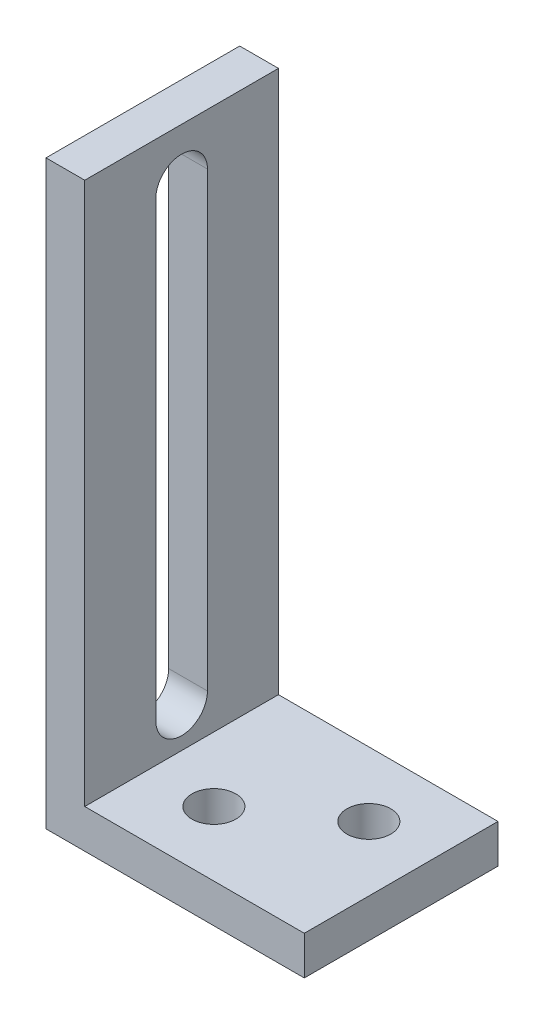
ISO-10303-21;
HEADER;
FILE_DESCRIPTION(('STEP AP214'),'2;1');
FILE_NAME('part.step','',(''),(''),'','','');
FILE_SCHEMA(('AUTOMOTIVE_DESIGN { 1 0 10303 214 1 1 1 1 }'));
ENDSEC;
DATA;
#1=APPLICATION_CONTEXT('core data for automotive mechanical design processes');
#2=APPLICATION_PROTOCOL_DEFINITION('international standard','automotive_design',2000,#1);
#3=PRODUCT_CONTEXT('',#1,'mechanical');
#4=PRODUCT('Part','Part','',(#3));
#5=PRODUCT_RELATED_PRODUCT_CATEGORY('part','',(#4));
#6=PRODUCT_DEFINITION_FORMATION('','',#4);
#7=PRODUCT_DEFINITION_CONTEXT('part definition',#1,'design');
#8=PRODUCT_DEFINITION('design','',#6,#7);
#9=PRODUCT_DEFINITION_SHAPE('','',#8);
#10=(LENGTH_UNIT() NAMED_UNIT(*) SI_UNIT(.MILLI.,.METRE.));
#11=(NAMED_UNIT(*) PLANE_ANGLE_UNIT() SI_UNIT($,.RADIAN.));
#12=(NAMED_UNIT(*) SI_UNIT($,.STERADIAN.) SOLID_ANGLE_UNIT());
#13=UNCERTAINTY_MEASURE_WITH_UNIT(LENGTH_MEASURE(1.E-05),#10,'distance_accuracy_value','');
#14=(GEOMETRIC_REPRESENTATION_CONTEXT(3) GLOBAL_UNCERTAINTY_ASSIGNED_CONTEXT((#13)) GLOBAL_UNIT_ASSIGNED_CONTEXT((#10,
#11,#12)) REPRESENTATION_CONTEXT('',''));
#15=CARTESIAN_POINT('',(0.,0.,0.));
#16=DIRECTION('',(0.,0.,1.));
#17=DIRECTION('',(1.,0.,0.));
#18=AXIS2_PLACEMENT_3D('',#15,#16,#17);
#19=CARTESIAN_POINT('',(0.,0.,15.));
#20=DIRECTION('',(1.,0.,0.));
#21=DIRECTION('',(0.,0.,-1.));
#22=AXIS2_PLACEMENT_3D('',#19,#20,#21);
#23=PLANE('',#22);
#24=DIRECTION('',(0.,-1.,0.));
#25=VECTOR('',#24,1.);
#26=CARTESIAN_POINT('',(0.,0.,5.5));
#27=LINE('',#26,#25);
#28=CARTESIAN_POINT('',(0.,41.,5.5));
#29=VERTEX_POINT('',#28);
#30=CARTESIAN_POINT('',(0.,6.,5.5));
#31=VERTEX_POINT('',#30);
#32=EDGE_CURVE('E141',#29,#31,#27,.T.);
#33=ORIENTED_EDGE('',*,*,#32,.F.);
#34=CARTESIAN_POINT('',(0.,41.,7.5));
#35=DIRECTION('',(-1.,0.,0.));
#36=DIRECTION('',(0.,0.,1.));
#37=AXIS2_PLACEMENT_3D('',#34,#35,#36);
#38=CIRCLE('',#37,2.);
#39=CARTESIAN_POINT('',(0.,41.,9.5));
#40=VERTEX_POINT('',#39);
#41=EDGE_CURVE('E67',#40,#29,#38,.T.);
#42=ORIENTED_EDGE('',*,*,#41,.F.);
#43=DIRECTION('',(0.,1.,0.));
#44=VECTOR('',#43,1.);
#45=CARTESIAN_POINT('',(0.,0.,9.5));
#46=LINE('',#45,#44);
#47=CARTESIAN_POINT('',(0.,6.,9.5));
#48=VERTEX_POINT('',#47);
#49=EDGE_CURVE('E147',#48,#40,#46,.T.);
#50=ORIENTED_EDGE('',*,*,#49,.F.);
#51=CARTESIAN_POINT('',(0.,6.,7.5));
#52=DIRECTION('',(-1.,0.,0.));
#53=DIRECTION('',(0.,0.,1.));
#54=AXIS2_PLACEMENT_3D('',#51,#52,#53);
#55=CIRCLE('',#54,2.);
#56=EDGE_CURVE('E132',#31,#48,#55,.T.);
#57=ORIENTED_EDGE('',*,*,#56,.F.);
#58=EDGE_LOOP('',(#33,#42,#50,#57));
#59=FACE_BOUND('',#58,.T.);
#60=DIRECTION('',(0.,-1.,0.));
#61=VECTOR('',#60,1.);
#62=CARTESIAN_POINT('',(0.,0.,0.));
#63=LINE('',#62,#61);
#64=CARTESIAN_POINT('',(0.,45.,0.));
#65=VERTEX_POINT('',#64);
#66=CARTESIAN_POINT('',(0.,0.,0.));
#67=VERTEX_POINT('',#66);
#68=EDGE_CURVE('E154',#65,#67,#63,.T.);
#69=ORIENTED_EDGE('',*,*,#68,.T.);
#70=DIRECTION('',(0.,0.,-1.));
#71=VECTOR('',#70,1.);
#72=CARTESIAN_POINT('',(0.,0.,15.));
#73=LINE('',#72,#71);
#74=CARTESIAN_POINT('',(0.,0.,15.));
#75=VERTEX_POINT('',#74);
#76=EDGE_CURVE('E197',#75,#67,#73,.T.);
#77=ORIENTED_EDGE('',*,*,#76,.F.);
#78=DIRECTION('',(0.,-1.,0.));
#79=VECTOR('',#78,1.);
#80=CARTESIAN_POINT('',(0.,0.,15.));
#81=LINE('',#80,#79);
#82=CARTESIAN_POINT('',(0.,45.,15.));
#83=VERTEX_POINT('',#82);
#84=EDGE_CURVE('E157',#83,#75,#81,.T.);
#85=ORIENTED_EDGE('',*,*,#84,.F.);
#86=DIRECTION('',(0.,0.,-1.));
#87=VECTOR('',#86,1.);
#88=CARTESIAN_POINT('',(0.,45.,15.));
#89=LINE('',#88,#87);
#90=EDGE_CURVE('E171',#83,#65,#89,.T.);
#91=ORIENTED_EDGE('',*,*,#90,.T.);
#92=EDGE_LOOP('',(#69,#77,#85,#91));
#93=FACE_BOUND('',#92,.T.);
#94=ADVANCED_FACE('F53',(#59,#93),#23,.F.);
#95=CARTESIAN_POINT('',(0.,0.,15.));
#96=DIRECTION('',(0.,1.,0.));
#97=DIRECTION('',(0.,0.,1.));
#98=AXIS2_PLACEMENT_3D('',#95,#96,#97);
#99=PLANE('',#98);
#100=CARTESIAN_POINT('',(15.,0.,5.));
#101=DIRECTION('',(0.,1.,0.));
#102=DIRECTION('',(0.,0.,1.));
#103=AXIS2_PLACEMENT_3D('',#100,#101,#102);
#104=CIRCLE('',#103,1.7);
#105=CARTESIAN_POINT('',(15.,0.,6.69999999999999));
#106=VERTEX_POINT('',#105);
#107=EDGE_CURVE('E352',#106,#106,#104,.F.);
#108=ORIENTED_EDGE('',*,*,#107,.F.);
#109=EDGE_LOOP('',(#108));
#110=FACE_BOUND('',#109,.T.);
#111=CARTESIAN_POINT('',(8.,0.,10.));
#112=DIRECTION('',(0.,1.,0.));
#113=DIRECTION('',(0.,0.,1.));
#114=AXIS2_PLACEMENT_3D('',#111,#112,#113);
#115=CIRCLE('',#114,1.7);
#116=CARTESIAN_POINT('',(8.,0.,11.7));
#117=VERTEX_POINT('',#116);
#118=EDGE_CURVE('E356',#117,#117,#115,.F.);
#119=ORIENTED_EDGE('',*,*,#118,.F.);
#120=EDGE_LOOP('',(#119));
#121=FACE_BOUND('',#120,.T.);
#122=DIRECTION('',(1.,0.,0.));
#123=VECTOR('',#122,1.);
#124=CARTESIAN_POINT('',(0.,0.,0.));
#125=LINE('',#124,#123);
#126=CARTESIAN_POINT('',(20.,0.,0.));
#127=VERTEX_POINT('',#126);
#128=EDGE_CURVE('E174',#67,#127,#125,.T.);
#129=ORIENTED_EDGE('',*,*,#128,.T.);
#130=DIRECTION('',(0.,0.,-1.));
#131=VECTOR('',#130,1.);
#132=CARTESIAN_POINT('',(20.,0.,15.));
#133=LINE('',#132,#131);
#134=CARTESIAN_POINT('',(20.,0.,15.));
#135=VERTEX_POINT('',#134);
#136=EDGE_CURVE('E194',#135,#127,#133,.T.);
#137=ORIENTED_EDGE('',*,*,#136,.F.);
#138=DIRECTION('',(1.,0.,0.));
#139=VECTOR('',#138,1.);
#140=CARTESIAN_POINT('',(0.,0.,15.));
#141=LINE('',#140,#139);
#142=EDGE_CURVE('E160',#75,#135,#141,.T.);
#143=ORIENTED_EDGE('',*,*,#142,.F.);
#144=ORIENTED_EDGE('',*,*,#76,.T.);
#145=EDGE_LOOP('',(#129,#137,#143,#144));
#146=FACE_BOUND('',#145,.T.);
#147=ADVANCED_FACE('F224',(#110,#121,#146),#99,.F.);
#148=CARTESIAN_POINT('',(20.,0.,15.));
#149=DIRECTION('',(-1.,0.,0.));
#150=DIRECTION('',(0.,0.,1.));
#151=AXIS2_PLACEMENT_3D('',#148,#149,#150);
#152=PLANE('',#151);
#153=DIRECTION('',(0.,1.,0.));
#154=VECTOR('',#153,1.);
#155=CARTESIAN_POINT('',(20.,0.,0.));
#156=LINE('',#155,#154);
#157=CARTESIAN_POINT('',(20.,3.,0.));
#158=VERTEX_POINT('',#157);
#159=EDGE_CURVE('E176',#127,#158,#156,.T.);
#160=ORIENTED_EDGE('',*,*,#159,.T.);
#161=DIRECTION('',(0.,0.,-1.));
#162=VECTOR('',#161,1.);
#163=CARTESIAN_POINT('',(20.,3.,15.));
#164=LINE('',#163,#162);
#165=CARTESIAN_POINT('',(20.,3.,15.));
#166=VERTEX_POINT('',#165);
#167=EDGE_CURVE('E191',#166,#158,#164,.T.);
#168=ORIENTED_EDGE('',*,*,#167,.F.);
#169=DIRECTION('',(0.,1.,0.));
#170=VECTOR('',#169,1.);
#171=CARTESIAN_POINT('',(20.,0.,15.));
#172=LINE('',#171,#170);
#173=EDGE_CURVE('E163',#135,#166,#172,.T.);
#174=ORIENTED_EDGE('',*,*,#173,.F.);
#175=ORIENTED_EDGE('',*,*,#136,.T.);
#176=EDGE_LOOP('',(#160,#168,#174,#175));
#177=FACE_BOUND('',#176,.T.);
#178=ADVANCED_FACE('F228',(#177),#152,.F.);
#179=CARTESIAN_POINT('',(3.,3.,15.));
#180=DIRECTION('',(0.,-1.,0.));
#181=DIRECTION('',(0.,0.,-1.));
#182=AXIS2_PLACEMENT_3D('',#179,#180,#181);
#183=PLANE('',#182);
#184=CARTESIAN_POINT('',(15.,3.,5.));
#185=DIRECTION('',(0.,1.,0.));
#186=DIRECTION('',(0.,0.,1.));
#187=AXIS2_PLACEMENT_3D('',#184,#185,#186);
#188=CIRCLE('',#187,1.7);
#189=CARTESIAN_POINT('',(15.,3.,6.69999999999999));
#190=VERTEX_POINT('',#189);
#191=EDGE_CURVE('E350',#190,#190,#188,.T.);
#192=ORIENTED_EDGE('',*,*,#191,.F.);
#193=EDGE_LOOP('',(#192));
#194=FACE_BOUND('',#193,.T.);
#195=CARTESIAN_POINT('',(8.,3.,10.));
#196=DIRECTION('',(0.,1.,0.));
#197=DIRECTION('',(0.,0.,1.));
#198=AXIS2_PLACEMENT_3D('',#195,#196,#197);
#199=CIRCLE('',#198,1.7);
#200=CARTESIAN_POINT('',(8.,3.,11.7));
#201=VERTEX_POINT('',#200);
#202=EDGE_CURVE('E353',#201,#201,#199,.T.);
#203=ORIENTED_EDGE('',*,*,#202,.F.);
#204=EDGE_LOOP('',(#203));
#205=FACE_BOUND('',#204,.T.);
#206=DIRECTION('',(-1.,0.,0.));
#207=VECTOR('',#206,1.);
#208=CARTESIAN_POINT('',(3.,3.,0.));
#209=LINE('',#208,#207);
#210=CARTESIAN_POINT('',(3.,3.,0.));
#211=VERTEX_POINT('',#210);
#212=EDGE_CURVE('E178',#158,#211,#209,.T.);
#213=ORIENTED_EDGE('',*,*,#212,.T.);
#214=DIRECTION('',(0.,0.,-1.));
#215=VECTOR('',#214,1.);
#216=CARTESIAN_POINT('',(3.,3.,15.));
#217=LINE('',#216,#215);
#218=CARTESIAN_POINT('',(3.,3.,15.));
#219=VERTEX_POINT('',#218);
#220=EDGE_CURVE('E188',#219,#211,#217,.T.);
#221=ORIENTED_EDGE('',*,*,#220,.F.);
#222=DIRECTION('',(-1.,0.,0.));
#223=VECTOR('',#222,1.);
#224=CARTESIAN_POINT('',(3.,3.,15.));
#225=LINE('',#224,#223);
#226=EDGE_CURVE('E165',#166,#219,#225,.T.);
#227=ORIENTED_EDGE('',*,*,#226,.F.);
#228=ORIENTED_EDGE('',*,*,#167,.T.);
#229=EDGE_LOOP('',(#213,#221,#227,#228));
#230=FACE_BOUND('',#229,.T.);
#231=ADVANCED_FACE('F233',(#194,#205,#230),#183,.F.);
#232=CARTESIAN_POINT('',(3.,45.,15.));
#233=DIRECTION('',(-1.,0.,0.));
#234=DIRECTION('',(0.,-1.,0.));
#235=AXIS2_PLACEMENT_3D('',#232,#233,#234);
#236=PLANE('',#235);
#237=DIRECTION('',(0.,1.,0.));
#238=VECTOR('',#237,1.);
#239=CARTESIAN_POINT('',(3.,45.,9.5));
#240=LINE('',#239,#238);
#241=CARTESIAN_POINT('',(3.,6.,9.5));
#242=VERTEX_POINT('',#241);
#243=CARTESIAN_POINT('',(3.,41.,9.5));
#244=VERTEX_POINT('',#243);
#245=EDGE_CURVE('E60',#242,#244,#240,.T.);
#246=ORIENTED_EDGE('',*,*,#245,.T.);
#247=CARTESIAN_POINT('',(3.,41.,7.5));
#248=DIRECTION('',(-1.,0.,0.));
#249=DIRECTION('',(0.,-1.,0.));
#250=AXIS2_PLACEMENT_3D('',#247,#248,#249);
#251=CIRCLE('',#250,2.);
#252=CARTESIAN_POINT('',(3.,41.,5.5));
#253=VERTEX_POINT('',#252);
#254=EDGE_CURVE('E12',#244,#253,#251,.T.);
#255=ORIENTED_EDGE('',*,*,#254,.T.);
#256=DIRECTION('',(0.,-1.,0.));
#257=VECTOR('',#256,1.);
#258=CARTESIAN_POINT('',(3.,45.,5.5));
#259=LINE('',#258,#257);
#260=CARTESIAN_POINT('',(3.,6.,5.5));
#261=VERTEX_POINT('',#260);
#262=EDGE_CURVE('E200',#253,#261,#259,.T.);
#263=ORIENTED_EDGE('',*,*,#262,.T.);
#264=CARTESIAN_POINT('',(3.,6.,7.5));
#265=DIRECTION('',(-1.,0.,0.));
#266=DIRECTION('',(0.,-1.,0.));
#267=AXIS2_PLACEMENT_3D('',#264,#265,#266);
#268=CIRCLE('',#267,2.);
#269=EDGE_CURVE('E135',#261,#242,#268,.T.);
#270=ORIENTED_EDGE('',*,*,#269,.T.);
#271=EDGE_LOOP('',(#246,#255,#263,#270));
#272=FACE_BOUND('',#271,.T.);
#273=DIRECTION('',(0.,1.,0.));
#274=VECTOR('',#273,1.);
#275=CARTESIAN_POINT('',(3.,45.,0.));
#276=LINE('',#275,#274);
#277=CARTESIAN_POINT('',(3.,45.,0.));
#278=VERTEX_POINT('',#277);
#279=EDGE_CURVE('E180',#211,#278,#276,.T.);
#280=ORIENTED_EDGE('',*,*,#279,.T.);
#281=DIRECTION('',(0.,0.,-1.));
#282=VECTOR('',#281,1.);
#283=CARTESIAN_POINT('',(3.,45.,15.));
#284=LINE('',#283,#282);
#285=CARTESIAN_POINT('',(3.,45.,15.));
#286=VERTEX_POINT('',#285);
#287=EDGE_CURVE('E185',#286,#278,#284,.T.);
#288=ORIENTED_EDGE('',*,*,#287,.F.);
#289=DIRECTION('',(0.,1.,0.));
#290=VECTOR('',#289,1.);
#291=CARTESIAN_POINT('',(3.,45.,15.));
#292=LINE('',#291,#290);
#293=EDGE_CURVE('E167',#219,#286,#292,.T.);
#294=ORIENTED_EDGE('',*,*,#293,.F.);
#295=ORIENTED_EDGE('',*,*,#220,.T.);
#296=EDGE_LOOP('',(#280,#288,#294,#295));
#297=FACE_BOUND('',#296,.T.);
#298=ADVANCED_FACE('F204',(#272,#297),#236,.F.);
#299=CARTESIAN_POINT('',(0.,45.,15.));
#300=DIRECTION('',(0.,-1.,0.));
#301=DIRECTION('',(0.,0.,-1.));
#302=AXIS2_PLACEMENT_3D('',#299,#300,#301);
#303=PLANE('',#302);
#304=DIRECTION('',(-1.,0.,0.));
#305=VECTOR('',#304,1.);
#306=CARTESIAN_POINT('',(0.,45.,0.));
#307=LINE('',#306,#305);
#308=EDGE_CURVE('E161',#278,#65,#307,.T.);
#309=ORIENTED_EDGE('',*,*,#308,.T.);
#310=ORIENTED_EDGE('',*,*,#90,.F.);
#311=DIRECTION('',(-1.,0.,0.));
#312=VECTOR('',#311,1.);
#313=CARTESIAN_POINT('',(0.,45.,15.));
#314=LINE('',#313,#312);
#315=EDGE_CURVE('E169',#286,#83,#314,.T.);
#316=ORIENTED_EDGE('',*,*,#315,.F.);
#317=ORIENTED_EDGE('',*,*,#287,.T.);
#318=EDGE_LOOP('',(#309,#310,#316,#317));
#319=FACE_BOUND('',#318,.T.);
#320=ADVANCED_FACE('F244',(#319),#303,.F.);
#321=CARTESIAN_POINT('',(0.,0.,15.));
#322=DIRECTION('',(0.,0.,-1.));
#323=DIRECTION('',(-1.,0.,0.));
#324=AXIS2_PLACEMENT_3D('',#321,#322,#323);
#325=PLANE('',#324);
#326=ORIENTED_EDGE('',*,*,#84,.T.);
#327=ORIENTED_EDGE('',*,*,#142,.T.);
#328=ORIENTED_EDGE('',*,*,#173,.T.);
#329=ORIENTED_EDGE('',*,*,#226,.T.);
#330=ORIENTED_EDGE('',*,*,#293,.T.);
#331=ORIENTED_EDGE('',*,*,#315,.T.);
#332=EDGE_LOOP('',(#326,#327,#328,#329,#330,#331));
#333=FACE_BOUND('',#332,.T.);
#334=ADVANCED_FACE('F218',(#333),#325,.F.);
#335=CARTESIAN_POINT('',(0.,0.,0.));
#336=DIRECTION('',(0.,0.,-1.));
#337=DIRECTION('',(-1.,0.,0.));
#338=AXIS2_PLACEMENT_3D('',#335,#336,#337);
#339=PLANE('',#338);
#340=ORIENTED_EDGE('',*,*,#68,.F.);
#341=ORIENTED_EDGE('',*,*,#308,.F.);
#342=ORIENTED_EDGE('',*,*,#279,.F.);
#343=ORIENTED_EDGE('',*,*,#212,.F.);
#344=ORIENTED_EDGE('',*,*,#159,.F.);
#345=ORIENTED_EDGE('',*,*,#128,.F.);
#346=EDGE_LOOP('',(#340,#341,#342,#343,#344,#345));
#347=FACE_BOUND('',#346,.T.);
#348=ADVANCED_FACE('F211',(#347),#339,.T.);
#349=CARTESIAN_POINT('',(6.,41.,7.5));
#350=DIRECTION('',(-1.,0.,0.));
#351=DIRECTION('',(0.,0.,1.));
#352=AXIS2_PLACEMENT_3D('',#349,#350,#351);
#353=CYLINDRICAL_SURFACE('',#352,2.);
#354=DIRECTION('',(-1.,0.,0.));
#355=VECTOR('',#354,1.);
#356=CARTESIAN_POINT('',(6.,41.,9.5));
#357=LINE('',#356,#355);
#358=EDGE_CURVE('E152',#244,#40,#357,.T.);
#359=ORIENTED_EDGE('',*,*,#358,.T.);
#360=ORIENTED_EDGE('',*,*,#41,.T.);
#361=DIRECTION('',(-1.,0.,0.));
#362=VECTOR('',#361,1.);
#363=CARTESIAN_POINT('',(6.,41.,5.5));
#364=LINE('',#363,#362);
#365=EDGE_CURVE('E138',#253,#29,#364,.T.);
#366=ORIENTED_EDGE('',*,*,#365,.F.);
#367=ORIENTED_EDGE('',*,*,#254,.F.);
#368=EDGE_LOOP('',(#359,#360,#366,#367));
#369=FACE_BOUND('',#368,.T.);
#370=ADVANCED_FACE('F209',(#369),#353,.F.);
#371=CARTESIAN_POINT('',(6.,0.,9.5));
#372=DIRECTION('',(0.,0.,1.));
#373=DIRECTION('',(1.,0.,0.));
#374=AXIS2_PLACEMENT_3D('',#371,#372,#373);
#375=PLANE('',#374);
#376=DIRECTION('',(-1.,0.,0.));
#377=VECTOR('',#376,1.);
#378=CARTESIAN_POINT('',(6.,6.,9.5));
#379=LINE('',#378,#377);
#380=EDGE_CURVE('E137',#242,#48,#379,.T.);
#381=ORIENTED_EDGE('',*,*,#380,.T.);
#382=ORIENTED_EDGE('',*,*,#49,.T.);
#383=ORIENTED_EDGE('',*,*,#358,.F.);
#384=ORIENTED_EDGE('',*,*,#245,.F.);
#385=EDGE_LOOP('',(#381,#382,#383,#384));
#386=FACE_BOUND('',#385,.T.);
#387=ADVANCED_FACE('F208',(#386),#375,.F.);
#388=CARTESIAN_POINT('',(6.,6.,7.5));
#389=DIRECTION('',(-1.,0.,0.));
#390=DIRECTION('',(0.,0.,1.));
#391=AXIS2_PLACEMENT_3D('',#388,#389,#390);
#392=CYLINDRICAL_SURFACE('',#391,2.);
#393=DIRECTION('',(-1.,0.,0.));
#394=VECTOR('',#393,1.);
#395=CARTESIAN_POINT('',(6.,6.,5.5));
#396=LINE('',#395,#394);
#397=EDGE_CURVE('E75',#261,#31,#396,.T.);
#398=ORIENTED_EDGE('',*,*,#397,.T.);
#399=ORIENTED_EDGE('',*,*,#56,.T.);
#400=ORIENTED_EDGE('',*,*,#380,.F.);
#401=ORIENTED_EDGE('',*,*,#269,.F.);
#402=EDGE_LOOP('',(#398,#399,#400,#401));
#403=FACE_BOUND('',#402,.T.);
#404=ADVANCED_FACE('F129',(#403),#392,.F.);
#405=CARTESIAN_POINT('',(6.,0.,5.5));
#406=DIRECTION('',(0.,0.,-1.));
#407=DIRECTION('',(-1.,0.,0.));
#408=AXIS2_PLACEMENT_3D('',#405,#406,#407);
#409=PLANE('',#408);
#410=ORIENTED_EDGE('',*,*,#365,.T.);
#411=ORIENTED_EDGE('',*,*,#32,.T.);
#412=ORIENTED_EDGE('',*,*,#397,.F.);
#413=ORIENTED_EDGE('',*,*,#262,.F.);
#414=EDGE_LOOP('',(#410,#411,#412,#413));
#415=FACE_BOUND('',#414,.T.);
#416=ADVANCED_FACE('F142',(#415),#409,.F.);
#417=CARTESIAN_POINT('',(8.,-0.00100000000000013,10.));
#418=DIRECTION('',(0.,1.,0.));
#419=DIRECTION('',(0.,0.,1.));
#420=AXIS2_PLACEMENT_3D('',#417,#418,#419);
#421=CYLINDRICAL_SURFACE('',#420,1.7);
#422=CARTESIAN_POINT('',(8.,3.,11.7));
#423=CARTESIAN_POINT('',(8.,2.96875,11.7));
#424=CARTESIAN_POINT('',(8.,2.9375,11.7));
#425=CARTESIAN_POINT('',(8.,2.875,11.7));
#426=CARTESIAN_POINT('',(8.,2.84375,11.7));
#427=CARTESIAN_POINT('',(8.,2.78125,11.7));
#428=CARTESIAN_POINT('',(8.,2.75,11.7));
#429=CARTESIAN_POINT('',(8.,2.6875,11.7));
#430=CARTESIAN_POINT('',(8.,2.65625,11.7));
#431=CARTESIAN_POINT('',(8.,2.59375,11.7));
#432=CARTESIAN_POINT('',(8.,2.5625,11.7));
#433=CARTESIAN_POINT('',(8.,2.5,11.7));
#434=CARTESIAN_POINT('',(8.,2.46875,11.7));
#435=CARTESIAN_POINT('',(8.,2.40625,11.7));
#436=CARTESIAN_POINT('',(8.,2.375,11.7));
#437=CARTESIAN_POINT('',(8.,2.3125,11.7));
#438=CARTESIAN_POINT('',(8.,2.28125,11.7));
#439=CARTESIAN_POINT('',(8.,2.21875,11.7));
#440=CARTESIAN_POINT('',(8.,2.1875,11.7));
#441=CARTESIAN_POINT('',(8.,2.125,11.7));
#442=CARTESIAN_POINT('',(8.,2.09375,11.7));
#443=CARTESIAN_POINT('',(8.,2.03125,11.7));
#444=CARTESIAN_POINT('',(8.,2.,11.7));
#445=CARTESIAN_POINT('',(8.,1.9375,11.7));
#446=CARTESIAN_POINT('',(8.,1.90625,11.7));
#447=CARTESIAN_POINT('',(8.,1.84375,11.7));
#448=CARTESIAN_POINT('',(8.,1.8125,11.7));
#449=CARTESIAN_POINT('',(8.,1.75,11.7));
#450=CARTESIAN_POINT('',(8.,1.71875,11.7));
#451=CARTESIAN_POINT('',(8.,1.65625,11.7));
#452=CARTESIAN_POINT('',(8.,1.625,11.7));
#453=CARTESIAN_POINT('',(8.,1.5625,11.7));
#454=CARTESIAN_POINT('',(8.,1.53125,11.7));
#455=CARTESIAN_POINT('',(8.,1.46875,11.7));
#456=CARTESIAN_POINT('',(8.,1.4375,11.7));
#457=CARTESIAN_POINT('',(8.,1.375,11.7));
#458=CARTESIAN_POINT('',(8.,1.34375,11.7));
#459=CARTESIAN_POINT('',(8.,1.28125,11.7));
#460=CARTESIAN_POINT('',(8.,1.25,11.7));
#461=CARTESIAN_POINT('',(8.,1.1875,11.7));
#462=CARTESIAN_POINT('',(8.,1.15625,11.7));
#463=CARTESIAN_POINT('',(8.,1.09375,11.7));
#464=CARTESIAN_POINT('',(8.,1.0625,11.7));
#465=CARTESIAN_POINT('',(8.,1.,11.7));
#466=CARTESIAN_POINT('',(8.,0.96875,11.7));
#467=CARTESIAN_POINT('',(8.,0.90625,11.7));
#468=CARTESIAN_POINT('',(8.,0.875,11.7));
#469=CARTESIAN_POINT('',(8.,0.8125,11.7));
#470=CARTESIAN_POINT('',(8.,0.78125,11.7));
#471=CARTESIAN_POINT('',(8.,0.71875,11.7));
#472=CARTESIAN_POINT('',(8.,0.6875,11.7));
#473=CARTESIAN_POINT('',(8.,0.625,11.7));
#474=CARTESIAN_POINT('',(8.,0.59375,11.7));
#475=CARTESIAN_POINT('',(8.,0.53125,11.7));
#476=CARTESIAN_POINT('',(8.,0.5,11.7));
#477=CARTESIAN_POINT('',(8.,0.4375,11.7));
#478=CARTESIAN_POINT('',(8.,0.40625,11.7));
#479=CARTESIAN_POINT('',(8.,0.34375,11.7));
#480=CARTESIAN_POINT('',(8.,0.3125,11.7));
#481=CARTESIAN_POINT('',(8.,0.25,11.7));
#482=CARTESIAN_POINT('',(8.,0.21875,11.7));
#483=CARTESIAN_POINT('',(8.,0.15625,11.7));
#484=CARTESIAN_POINT('',(8.,0.125,11.7));
#485=CARTESIAN_POINT('',(8.,0.0625000000000001,11.7));
#486=CARTESIAN_POINT('',(8.,0.0312500000000001,11.7));
#487=CARTESIAN_POINT('',(8.,0.,11.7));
#488=B_SPLINE_CURVE_WITH_KNOTS('',3,(#422,#423,#424,#425,#426,#427,#428,#429,#430,#431,#432,
#433,#434,#435,#436,#437,#438,#439,#440,#441,#442,#443,#444,#445,#446,#447,#448,#449,#450,#451,
#452,#453,#454,#455,#456,#457,#458,#459,#460,#461,#462,#463,#464,#465,#466,#467,#468,#469,#470,
#471,#472,#473,#474,#475,#476,#477,#478,#479,#480,#481,#482,#483,#484,#485,#486,#487),
.UNSPECIFIED.,.F.,.F.,(4,2,2,2,2,2,2,2,2,2,2,2,2,2,2,2,2,2,2,2,2,2,2,2,2,2,2,2,2,2,2,2,4),(0.,
0.0937500000000001,0.1875,0.28125,0.375,0.46875,0.5625,0.65625,0.75,0.84375,0.9375,1.03125,
1.125,1.21875,1.3125,1.40625,1.5,1.59375,1.6875,1.78125,1.875,1.96875,2.0625,2.15625,2.25,
2.34375,2.4375,2.53125,2.625,2.71875,2.8125,2.90625,3.),.UNSPECIFIED.);
#489=EDGE_CURVE('BSEAM315',#201,#117,#488,.T.);
#490=ORIENTED_EDGE('',*,*,#202,.T.);
#491=ORIENTED_EDGE('',*,*,#118,.T.);
#492=ORIENTED_EDGE('',*,*,#489,.T.);
#493=ORIENTED_EDGE('',*,*,#489,.F.);
#494=EDGE_LOOP('',(#490,#492,#491,#493));
#495=FACE_BOUND('',#494,.T.);
#496=ADVANCED_FACE('F315',(#495),#421,.F.);
#497=CARTESIAN_POINT('',(15.,-0.00100000000000013,5.));
#498=DIRECTION('',(0.,1.,0.));
#499=DIRECTION('',(0.,0.,1.));
#500=AXIS2_PLACEMENT_3D('',#497,#498,#499);
#501=CYLINDRICAL_SURFACE('',#500,1.7);
#502=CARTESIAN_POINT('',(15.,3.,6.69999999999999));
#503=CARTESIAN_POINT('',(15.,2.96875,6.69999999999999));
#504=CARTESIAN_POINT('',(15.,2.9375,6.69999999999999));
#505=CARTESIAN_POINT('',(15.,2.875,6.69999999999999));
#506=CARTESIAN_POINT('',(15.,2.84375,6.69999999999999));
#507=CARTESIAN_POINT('',(15.,2.78125,6.69999999999999));
#508=CARTESIAN_POINT('',(15.,2.75,6.69999999999999));
#509=CARTESIAN_POINT('',(15.,2.6875,6.69999999999999));
#510=CARTESIAN_POINT('',(15.,2.65625,6.69999999999999));
#511=CARTESIAN_POINT('',(15.,2.59375,6.69999999999999));
#512=CARTESIAN_POINT('',(15.,2.5625,6.69999999999999));
#513=CARTESIAN_POINT('',(15.,2.5,6.69999999999999));
#514=CARTESIAN_POINT('',(15.,2.46875,6.69999999999999));
#515=CARTESIAN_POINT('',(15.,2.40625,6.69999999999999));
#516=CARTESIAN_POINT('',(15.,2.375,6.69999999999999));
#517=CARTESIAN_POINT('',(15.,2.3125,6.69999999999999));
#518=CARTESIAN_POINT('',(15.,2.28125,6.69999999999999));
#519=CARTESIAN_POINT('',(15.,2.21875,6.69999999999999));
#520=CARTESIAN_POINT('',(15.,2.1875,6.69999999999999));
#521=CARTESIAN_POINT('',(15.,2.125,6.69999999999999));
#522=CARTESIAN_POINT('',(15.,2.09375,6.69999999999999));
#523=CARTESIAN_POINT('',(15.,2.03125,6.69999999999999));
#524=CARTESIAN_POINT('',(15.,2.,6.69999999999999));
#525=CARTESIAN_POINT('',(15.,1.9375,6.69999999999999));
#526=CARTESIAN_POINT('',(15.,1.90625,6.69999999999999));
#527=CARTESIAN_POINT('',(15.,1.84375,6.69999999999999));
#528=CARTESIAN_POINT('',(15.,1.8125,6.69999999999999));
#529=CARTESIAN_POINT('',(15.,1.75,6.69999999999999));
#530=CARTESIAN_POINT('',(15.,1.71875,6.69999999999999));
#531=CARTESIAN_POINT('',(15.,1.65625,6.69999999999999));
#532=CARTESIAN_POINT('',(15.,1.625,6.69999999999999));
#533=CARTESIAN_POINT('',(15.,1.5625,6.69999999999999));
#534=CARTESIAN_POINT('',(15.,1.53125,6.69999999999999));
#535=CARTESIAN_POINT('',(15.,1.46875,6.69999999999999));
#536=CARTESIAN_POINT('',(15.,1.4375,6.69999999999999));
#537=CARTESIAN_POINT('',(15.,1.375,6.69999999999999));
#538=CARTESIAN_POINT('',(15.,1.34375,6.69999999999999));
#539=CARTESIAN_POINT('',(15.,1.28125,6.69999999999999));
#540=CARTESIAN_POINT('',(15.,1.25,6.69999999999999));
#541=CARTESIAN_POINT('',(15.,1.1875,6.69999999999999));
#542=CARTESIAN_POINT('',(15.,1.15625,6.69999999999999));
#543=CARTESIAN_POINT('',(15.,1.09375,6.69999999999999));
#544=CARTESIAN_POINT('',(15.,1.0625,6.69999999999999));
#545=CARTESIAN_POINT('',(15.,1.,6.69999999999999));
#546=CARTESIAN_POINT('',(15.,0.96875,6.69999999999999));
#547=CARTESIAN_POINT('',(15.,0.90625,6.69999999999999));
#548=CARTESIAN_POINT('',(15.,0.875,6.69999999999999));
#549=CARTESIAN_POINT('',(15.,0.8125,6.69999999999999));
#550=CARTESIAN_POINT('',(15.,0.78125,6.69999999999999));
#551=CARTESIAN_POINT('',(15.,0.71875,6.69999999999999));
#552=CARTESIAN_POINT('',(15.,0.6875,6.69999999999999));
#553=CARTESIAN_POINT('',(15.,0.625,6.69999999999999));
#554=CARTESIAN_POINT('',(15.,0.59375,6.69999999999999));
#555=CARTESIAN_POINT('',(15.,0.53125,6.69999999999999));
#556=CARTESIAN_POINT('',(15.,0.5,6.69999999999999));
#557=CARTESIAN_POINT('',(15.,0.4375,6.69999999999999));
#558=CARTESIAN_POINT('',(15.,0.40625,6.69999999999999));
#559=CARTESIAN_POINT('',(15.,0.34375,6.69999999999999));
#560=CARTESIAN_POINT('',(15.,0.3125,6.69999999999999));
#561=CARTESIAN_POINT('',(15.,0.25,6.69999999999999));
#562=CARTESIAN_POINT('',(15.,0.21875,6.69999999999999));
#563=CARTESIAN_POINT('',(15.,0.15625,6.69999999999999));
#564=CARTESIAN_POINT('',(15.,0.125,6.69999999999999));
#565=CARTESIAN_POINT('',(15.,0.0625000000000001,6.69999999999999));
#566=CARTESIAN_POINT('',(15.,0.0312500000000001,6.69999999999999));
#567=CARTESIAN_POINT('',(15.,0.,6.69999999999999));
#568=B_SPLINE_CURVE_WITH_KNOTS('',3,(#502,#503,#504,#505,#506,#507,#508,#509,#510,#511,#512,
#513,#514,#515,#516,#517,#518,#519,#520,#521,#522,#523,#524,#525,#526,#527,#528,#529,#530,#531,
#532,#533,#534,#535,#536,#537,#538,#539,#540,#541,#542,#543,#544,#545,#546,#547,#548,#549,#550,
#551,#552,#553,#554,#555,#556,#557,#558,#559,#560,#561,#562,#563,#564,#565,#566,#567),
.UNSPECIFIED.,.F.,.F.,(4,2,2,2,2,2,2,2,2,2,2,2,2,2,2,2,2,2,2,2,2,2,2,2,2,2,2,2,2,2,2,2,4),(0.,
0.0937500000000001,0.1875,0.28125,0.375,0.46875,0.5625,0.65625,0.75,0.84375,0.9375,1.03125,
1.125,1.21875,1.3125,1.40625,1.5,1.59375,1.6875,1.78125,1.875,1.96875,2.0625,2.15625,2.25,
2.34375,2.4375,2.53125,2.625,2.71875,2.8125,2.90625,3.),.UNSPECIFIED.);
#569=EDGE_CURVE('BSEAM333',#190,#106,#568,.T.);
#570=ORIENTED_EDGE('',*,*,#191,.T.);
#571=ORIENTED_EDGE('',*,*,#107,.T.);
#572=ORIENTED_EDGE('',*,*,#569,.T.);
#573=ORIENTED_EDGE('',*,*,#569,.F.);
#574=EDGE_LOOP('',(#570,#572,#571,#573));
#575=FACE_BOUND('',#574,.T.);
#576=ADVANCED_FACE('F333',(#575),#501,.F.);
#577=CLOSED_SHELL('',(#94,#147,#178,#231,#298,#320,#334,#348,#370,#387,#404,#416,#496,#576));
#578=MANIFOLD_SOLID_BREP('B2',#577);
#579=ADVANCED_BREP_SHAPE_REPRESENTATION('',(#18,#578),#14);
#580=SHAPE_DEFINITION_REPRESENTATION(#9,#579);
ENDSEC;
END-ISO-10303-21;
